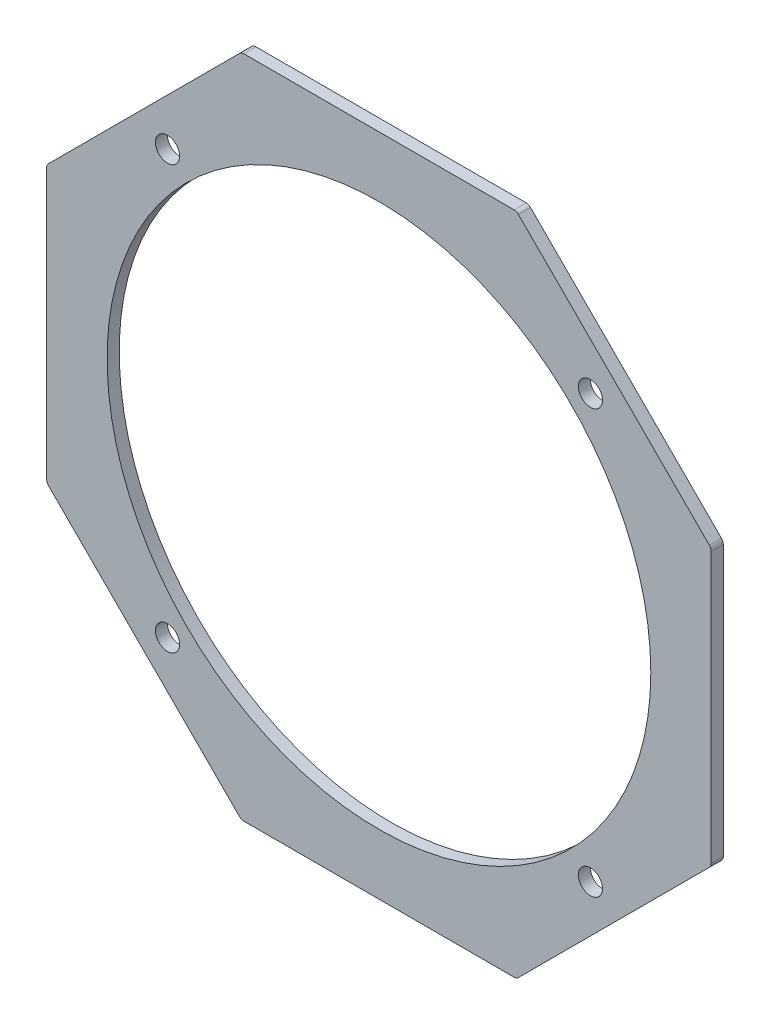
ISO-10303-21;
HEADER;
FILE_DESCRIPTION(('STEP AP214'),'2;1');
FILE_NAME('part.step','',(''),(''),'','','');
FILE_SCHEMA(('AUTOMOTIVE_DESIGN { 1 0 10303 214 1 1 1 1 }'));
ENDSEC;
DATA;
#1=APPLICATION_CONTEXT('core data for automotive mechanical design processes');
#2=APPLICATION_PROTOCOL_DEFINITION('international standard','automotive_design',2000,#1);
#3=PRODUCT_CONTEXT('',#1,'mechanical');
#4=PRODUCT('Part','Part','',(#3));
#5=PRODUCT_RELATED_PRODUCT_CATEGORY('part','',(#4));
#6=PRODUCT_DEFINITION_FORMATION('','',#4);
#7=PRODUCT_DEFINITION_CONTEXT('part definition',#1,'design');
#8=PRODUCT_DEFINITION('design','',#6,#7);
#9=PRODUCT_DEFINITION_SHAPE('','',#8);
#10=(LENGTH_UNIT() NAMED_UNIT(*) SI_UNIT(.MILLI.,.METRE.));
#11=(NAMED_UNIT(*) PLANE_ANGLE_UNIT() SI_UNIT($,.RADIAN.));
#12=(NAMED_UNIT(*) SI_UNIT($,.STERADIAN.) SOLID_ANGLE_UNIT());
#13=UNCERTAINTY_MEASURE_WITH_UNIT(LENGTH_MEASURE(1.E-05),#10,'distance_accuracy_value','');
#14=(GEOMETRIC_REPRESENTATION_CONTEXT(3) GLOBAL_UNCERTAINTY_ASSIGNED_CONTEXT((#13)) GLOBAL_UNIT_ASSIGNED_CONTEXT((#10,
#11,#12)) REPRESENTATION_CONTEXT('',''));
#15=CARTESIAN_POINT('',(0.,0.,0.));
#16=DIRECTION('',(0.,0.,1.));
#17=DIRECTION('',(1.,0.,0.));
#18=AXIS2_PLACEMENT_3D('',#15,#16,#17);
#19=CARTESIAN_POINT('',(0.,2001.48951402047,2.));
#20=DIRECTION('',(0.,-1.,0.));
#21=DIRECTION('',(0.,0.,-1.));
#22=AXIS2_PLACEMENT_3D('',#19,#20,#21);
#23=PLANE('',#22);
#24=DIRECTION('',(-1.,0.,0.));
#25=VECTOR('',#24,1.);
#26=CARTESIAN_POINT('',(0.,2001.48951402047,0.));
#27=LINE('',#26,#25);
#28=CARTESIAN_POINT('',(2676.01725865301,2001.48951402047,0.));
#29=VERTEX_POINT('',#28);
#30=CARTESIAN_POINT('',(2631.28219391672,2001.48951402047,0.));
#31=VERTEX_POINT('',#30);
#32=EDGE_CURVE('E199',#29,#31,#27,.T.);
#33=ORIENTED_EDGE('',*,*,#32,.T.);
#34=DIRECTION('',(0.,0.,-1.));
#35=VECTOR('',#34,1.);
#36=CARTESIAN_POINT('',(2631.28219391672,2001.48951402047,2.));
#37=LINE('',#36,#35);
#38=CARTESIAN_POINT('',(2631.28219391672,2001.48951402047,2.));
#39=VERTEX_POINT('',#38);
#40=EDGE_CURVE('E11',#39,#31,#37,.T.);
#41=ORIENTED_EDGE('',*,*,#40,.F.);
#42=DIRECTION('',(-1.,0.,0.));
#43=VECTOR('',#42,1.);
#44=CARTESIAN_POINT('',(0.,2001.48951402047,2.));
#45=LINE('',#44,#43);
#46=CARTESIAN_POINT('',(2676.01725865301,2001.48951402047,2.));
#47=VERTEX_POINT('',#46);
#48=EDGE_CURVE('E316',#47,#39,#45,.T.);
#49=ORIENTED_EDGE('',*,*,#48,.F.);
#50=DIRECTION('',(0.,0.,-1.));
#51=VECTOR('',#50,1.);
#52=CARTESIAN_POINT('',(2676.01725865301,2001.48951402047,2.));
#53=LINE('',#52,#51);
#54=EDGE_CURVE('E180',#47,#29,#53,.T.);
#55=ORIENTED_EDGE('',*,*,#54,.T.);
#56=EDGE_LOOP('',(#33,#41,#49,#55));
#57=FACE_BOUND('',#56,.T.);
#58=ADVANCED_FACE('F39',(#57),#23,.F.);
#59=CARTESIAN_POINT('',(2631.28219391672,2000.48951402047,2.));
#60=DIRECTION('',(0.,0.,-1.));
#61=DIRECTION('',(-1.,0.,0.));
#62=AXIS2_PLACEMENT_3D('',#59,#60,#61);
#63=CYLINDRICAL_SURFACE('',#62,1.00000000000034);
#64=CARTESIAN_POINT('',(2631.28219391672,2000.48951402047,0.));
#65=DIRECTION('',(0.,0.,1.));
#66=DIRECTION('',(1.,0.,0.));
#67=AXIS2_PLACEMENT_3D('',#64,#65,#66);
#68=CIRCLE('',#67,1.00000000000034);
#69=CARTESIAN_POINT('',(2630.57508713553,2001.19662080166,0.));
#70=VERTEX_POINT('',#69);
#71=EDGE_CURVE('E202',#31,#70,#68,.T.);
#72=ORIENTED_EDGE('',*,*,#71,.T.);
#73=DIRECTION('',(0.,0.,-1.));
#74=VECTOR('',#73,1.);
#75=CARTESIAN_POINT('',(2630.57508713553,2001.19662080166,2.));
#76=LINE('',#75,#74);
#77=CARTESIAN_POINT('',(2630.57508713553,2001.19662080166,2.));
#78=VERTEX_POINT('',#77);
#79=EDGE_CURVE('E48',#78,#70,#76,.T.);
#80=ORIENTED_EDGE('',*,*,#79,.F.);
#81=CARTESIAN_POINT('',(2631.28219391672,2000.48951402047,2.));
#82=DIRECTION('',(0.,0.,1.));
#83=DIRECTION('',(1.,0.,0.));
#84=AXIS2_PLACEMENT_3D('',#81,#82,#83);
#85=CIRCLE('',#84,1.00000000000034);
#86=EDGE_CURVE('E123',#39,#78,#85,.T.);
#87=ORIENTED_EDGE('',*,*,#86,.F.);
#88=ORIENTED_EDGE('',*,*,#40,.T.);
#89=EDGE_LOOP('',(#72,#80,#87,#88));
#90=FACE_BOUND('',#89,.T.);
#91=ADVANCED_FACE('F331',(#90),#63,.T.);
#92=CARTESIAN_POINT('',(314.689233166936,-314.689233166936,2.));
#93=DIRECTION('',(0.707106781186547,-0.707106781186547,0.));
#94=DIRECTION('',(0.707106781186548,0.707106781186548,0.));
#95=AXIS2_PLACEMENT_3D('',#92,#93,#94);
#96=PLANE('',#95);
#97=DIRECTION('',(-0.707106781186548,-0.707106781186548,0.));
#98=VECTOR('',#97,1.);
#99=CARTESIAN_POINT('',(314.689233166936,-314.689233166936,0.));
#100=LINE('',#99,#98);
#101=CARTESIAN_POINT('',(2598.94261950368,1969.56415316981,0.));
#102=VERTEX_POINT('',#101);
#103=EDGE_CURVE('E204',#70,#102,#100,.T.);
#104=ORIENTED_EDGE('',*,*,#103,.T.);
#105=DIRECTION('',(0.,0.,-1.));
#106=VECTOR('',#105,1.);
#107=CARTESIAN_POINT('',(2598.94261950368,1969.56415316981,2.));
#108=LINE('',#107,#106);
#109=CARTESIAN_POINT('',(2598.94261950368,1969.56415316981,2.));
#110=VERTEX_POINT('',#109);
#111=EDGE_CURVE('E260',#110,#102,#108,.T.);
#112=ORIENTED_EDGE('',*,*,#111,.F.);
#113=DIRECTION('',(-0.707106781186548,-0.707106781186548,0.));
#114=VECTOR('',#113,1.);
#115=CARTESIAN_POINT('',(314.689233166936,-314.689233166936,2.));
#116=LINE('',#115,#114);
#117=EDGE_CURVE('E268',#78,#110,#116,.T.);
#118=ORIENTED_EDGE('',*,*,#117,.F.);
#119=ORIENTED_EDGE('',*,*,#79,.T.);
#120=EDGE_LOOP('',(#104,#112,#118,#119));
#121=FACE_BOUND('',#120,.T.);
#122=ADVANCED_FACE('F266',(#121),#96,.F.);
#123=CARTESIAN_POINT('',(2599.64972628487,1968.85704638862,2.));
#124=DIRECTION('',(0.,0.,-1.));
#125=DIRECTION('',(-1.,0.,0.));
#126=AXIS2_PLACEMENT_3D('',#123,#124,#125);
#127=CYLINDRICAL_SURFACE('',#126,0.999999999999048);
#128=CARTESIAN_POINT('',(2599.64972628487,1968.85704638862,0.));
#129=DIRECTION('',(0.,0.,1.));
#130=DIRECTION('',(1.,0.,0.));
#131=AXIS2_PLACEMENT_3D('',#128,#129,#130);
#132=CIRCLE('',#131,0.999999999999048);
#133=CARTESIAN_POINT('',(2598.64972628487,1968.85704638862,0.));
#134=VERTEX_POINT('',#133);
#135=EDGE_CURVE('E206',#102,#134,#132,.T.);
#136=ORIENTED_EDGE('',*,*,#135,.T.);
#137=DIRECTION('',(0.,0.,-1.));
#138=VECTOR('',#137,1.);
#139=CARTESIAN_POINT('',(2598.64972628487,1968.85704638862,2.));
#140=LINE('',#139,#138);
#141=CARTESIAN_POINT('',(2598.64972628487,1968.85704638862,2.));
#142=VERTEX_POINT('',#141);
#143=EDGE_CURVE('E257',#142,#134,#140,.T.);
#144=ORIENTED_EDGE('',*,*,#143,.F.);
#145=CARTESIAN_POINT('',(2599.64972628487,1968.85704638862,2.));
#146=DIRECTION('',(0.,0.,1.));
#147=DIRECTION('',(1.,0.,0.));
#148=AXIS2_PLACEMENT_3D('',#145,#146,#147);
#149=CIRCLE('',#148,0.999999999999048);
#150=EDGE_CURVE('E286',#110,#142,#149,.T.);
#151=ORIENTED_EDGE('',*,*,#150,.F.);
#152=ORIENTED_EDGE('',*,*,#111,.T.);
#153=EDGE_LOOP('',(#136,#144,#151,#152));
#154=FACE_BOUND('',#153,.T.);
#155=ADVANCED_FACE('F277',(#154),#127,.T.);
#156=CARTESIAN_POINT('',(2598.64972628487,0.,2.));
#157=DIRECTION('',(1.,0.,0.));
#158=DIRECTION('',(0.,0.,-1.));
#159=AXIS2_PLACEMENT_3D('',#156,#157,#158);
#160=PLANE('',#159);
#161=DIRECTION('',(0.,-1.,0.));
#162=VECTOR('',#161,1.);
#163=CARTESIAN_POINT('',(2598.64972628487,0.,0.));
#164=LINE('',#163,#162);
#165=CARTESIAN_POINT('',(2598.64972628487,1924.12198165233,0.));
#166=VERTEX_POINT('',#165);
#167=EDGE_CURVE('E208',#134,#166,#164,.T.);
#168=ORIENTED_EDGE('',*,*,#167,.T.);
#169=DIRECTION('',(0.,0.,-1.));
#170=VECTOR('',#169,1.);
#171=CARTESIAN_POINT('',(2598.64972628487,1924.12198165233,2.));
#172=LINE('',#171,#170);
#173=CARTESIAN_POINT('',(2598.64972628487,1924.12198165233,2.));
#174=VERTEX_POINT('',#173);
#175=EDGE_CURVE('E254',#174,#166,#172,.T.);
#176=ORIENTED_EDGE('',*,*,#175,.F.);
#177=DIRECTION('',(0.,-1.,0.));
#178=VECTOR('',#177,1.);
#179=CARTESIAN_POINT('',(2598.64972628487,0.,2.));
#180=LINE('',#179,#178);
#181=EDGE_CURVE('E283',#142,#174,#180,.T.);
#182=ORIENTED_EDGE('',*,*,#181,.F.);
#183=ORIENTED_EDGE('',*,*,#143,.T.);
#184=EDGE_LOOP('',(#168,#176,#182,#183));
#185=FACE_BOUND('',#184,.T.);
#186=ADVANCED_FACE('F281',(#185),#160,.F.);
#187=CARTESIAN_POINT('',(2599.64972628487,1924.12198165233,2.));
#188=DIRECTION('',(0.,0.,-1.));
#189=DIRECTION('',(-1.,0.,0.));
#190=AXIS2_PLACEMENT_3D('',#187,#188,#189);
#191=CYLINDRICAL_SURFACE('',#190,1.00000000000042);
#192=CARTESIAN_POINT('',(2599.64972628487,1924.12198165233,0.));
#193=DIRECTION('',(0.,0.,1.));
#194=DIRECTION('',(1.,0.,0.));
#195=AXIS2_PLACEMENT_3D('',#192,#193,#194);
#196=CIRCLE('',#195,1.00000000000042);
#197=CARTESIAN_POINT('',(2598.94261950368,1923.41487487114,0.));
#198=VERTEX_POINT('',#197);
#199=EDGE_CURVE('E210',#166,#198,#196,.T.);
#200=ORIENTED_EDGE('',*,*,#199,.T.);
#201=DIRECTION('',(0.,0.,-1.));
#202=VECTOR('',#201,1.);
#203=CARTESIAN_POINT('',(2598.94261950368,1923.41487487114,2.));
#204=LINE('',#203,#202);
#205=CARTESIAN_POINT('',(2598.94261950368,1923.41487487114,2.));
#206=VERTEX_POINT('',#205);
#207=EDGE_CURVE('E251',#206,#198,#204,.T.);
#208=ORIENTED_EDGE('',*,*,#207,.F.);
#209=CARTESIAN_POINT('',(2599.64972628487,1924.12198165233,2.));
#210=DIRECTION('',(0.,0.,1.));
#211=DIRECTION('',(1.,0.,0.));
#212=AXIS2_PLACEMENT_3D('',#209,#210,#211);
#213=CIRCLE('',#212,1.00000000000042);
#214=EDGE_CURVE('E285',#174,#206,#213,.T.);
#215=ORIENTED_EDGE('',*,*,#214,.F.);
#216=ORIENTED_EDGE('',*,*,#175,.T.);
#217=EDGE_LOOP('',(#200,#208,#215,#216));
#218=FACE_BOUND('',#217,.T.);
#219=ADVANCED_FACE('F462',(#218),#191,.T.);
#220=CARTESIAN_POINT('',(2261.17874718741,2261.17874718741,2.));
#221=DIRECTION('',(0.707106781186547,0.707106781186547,0.));
#222=DIRECTION('',(-0.707106781186548,0.707106781186548,0.));
#223=AXIS2_PLACEMENT_3D('',#220,#221,#222);
#224=PLANE('',#223);
#225=DIRECTION('',(0.707106781186548,-0.707106781186548,0.));
#226=VECTOR('',#225,1.);
#227=CARTESIAN_POINT('',(2261.17874718741,2261.17874718741,0.));
#228=LINE('',#227,#226);
#229=CARTESIAN_POINT('',(2630.57508713553,1891.78240723929,0.));
#230=VERTEX_POINT('',#229);
#231=EDGE_CURVE('E212',#198,#230,#228,.T.);
#232=ORIENTED_EDGE('',*,*,#231,.T.);
#233=DIRECTION('',(0.,0.,-1.));
#234=VECTOR('',#233,1.);
#235=CARTESIAN_POINT('',(2630.57508713553,1891.78240723929,2.));
#236=LINE('',#235,#234);
#237=CARTESIAN_POINT('',(2630.57508713553,1891.78240723929,2.));
#238=VERTEX_POINT('',#237);
#239=EDGE_CURVE('E248',#238,#230,#236,.T.);
#240=ORIENTED_EDGE('',*,*,#239,.F.);
#241=DIRECTION('',(0.707106781186548,-0.707106781186548,0.));
#242=VECTOR('',#241,1.);
#243=CARTESIAN_POINT('',(2261.17874718741,2261.17874718741,2.));
#244=LINE('',#243,#242);
#245=EDGE_CURVE('E288',#206,#238,#244,.T.);
#246=ORIENTED_EDGE('',*,*,#245,.F.);
#247=ORIENTED_EDGE('',*,*,#207,.T.);
#248=EDGE_LOOP('',(#232,#240,#246,#247));
#249=FACE_BOUND('',#248,.T.);
#250=ADVANCED_FACE('F454',(#249),#224,.F.);
#251=CARTESIAN_POINT('',(2631.28219391672,1892.48951402047,2.));
#252=DIRECTION('',(0.,0.,-1.));
#253=DIRECTION('',(-1.,0.,0.));
#254=AXIS2_PLACEMENT_3D('',#251,#252,#253);
#255=CYLINDRICAL_SURFACE('',#254,1.00000000000015);
#256=CARTESIAN_POINT('',(2631.28219391672,1892.48951402047,0.));
#257=DIRECTION('',(0.,0.,1.));
#258=DIRECTION('',(1.,0.,0.));
#259=AXIS2_PLACEMENT_3D('',#256,#257,#258);
#260=CIRCLE('',#259,1.00000000000015);
#261=CARTESIAN_POINT('',(2631.28219391672,1891.48951402047,0.));
#262=VERTEX_POINT('',#261);
#263=EDGE_CURVE('E214',#230,#262,#260,.T.);
#264=ORIENTED_EDGE('',*,*,#263,.T.);
#265=DIRECTION('',(0.,0.,-1.));
#266=VECTOR('',#265,1.);
#267=CARTESIAN_POINT('',(2631.28219391672,1891.48951402047,2.));
#268=LINE('',#267,#266);
#269=CARTESIAN_POINT('',(2631.28219391672,1891.48951402047,2.));
#270=VERTEX_POINT('',#269);
#271=EDGE_CURVE('E245',#270,#262,#268,.T.);
#272=ORIENTED_EDGE('',*,*,#271,.F.);
#273=CARTESIAN_POINT('',(2631.28219391672,1892.48951402047,2.));
#274=DIRECTION('',(0.,0.,1.));
#275=DIRECTION('',(1.,0.,0.));
#276=AXIS2_PLACEMENT_3D('',#273,#274,#275);
#277=CIRCLE('',#276,1.00000000000015);
#278=EDGE_CURVE('E294',#238,#270,#277,.T.);
#279=ORIENTED_EDGE('',*,*,#278,.F.);
#280=ORIENTED_EDGE('',*,*,#239,.T.);
#281=EDGE_LOOP('',(#264,#272,#279,#280));
#282=FACE_BOUND('',#281,.T.);
#283=ADVANCED_FACE('F446',(#282),#255,.T.);
#284=CARTESIAN_POINT('',(0.,1891.48951402047,2.));
#285=DIRECTION('',(0.,1.,0.));
#286=DIRECTION('',(0.,0.,1.));
#287=AXIS2_PLACEMENT_3D('',#284,#285,#286);
#288=PLANE('',#287);
#289=DIRECTION('',(1.,0.,0.));
#290=VECTOR('',#289,1.);
#291=CARTESIAN_POINT('',(0.,1891.48951402047,0.));
#292=LINE('',#291,#290);
#293=CARTESIAN_POINT('',(2676.01725865301,1891.48951402047,0.));
#294=VERTEX_POINT('',#293);
#295=EDGE_CURVE('E216',#262,#294,#292,.T.);
#296=ORIENTED_EDGE('',*,*,#295,.T.);
#297=DIRECTION('',(0.,0.,-1.));
#298=VECTOR('',#297,1.);
#299=CARTESIAN_POINT('',(2676.01725865301,1891.48951402047,2.));
#300=LINE('',#299,#298);
#301=CARTESIAN_POINT('',(2676.01725865301,1891.48951402047,2.));
#302=VERTEX_POINT('',#301);
#303=EDGE_CURVE('E242',#302,#294,#300,.T.);
#304=ORIENTED_EDGE('',*,*,#303,.F.);
#305=DIRECTION('',(1.,0.,0.));
#306=VECTOR('',#305,1.);
#307=CARTESIAN_POINT('',(0.,1891.48951402047,2.));
#308=LINE('',#307,#306);
#309=EDGE_CURVE('E296',#270,#302,#308,.T.);
#310=ORIENTED_EDGE('',*,*,#309,.F.);
#311=ORIENTED_EDGE('',*,*,#271,.T.);
#312=EDGE_LOOP('',(#296,#304,#310,#311));
#313=FACE_BOUND('',#312,.T.);
#314=ADVANCED_FACE('F438',(#313),#288,.F.);
#315=CARTESIAN_POINT('',(2676.01725865301,1892.48951402047,2.));
#316=DIRECTION('',(0.,0.,-1.));
#317=DIRECTION('',(-1.,0.,0.));
#318=AXIS2_PLACEMENT_3D('',#315,#316,#317);
#319=CYLINDRICAL_SURFACE('',#318,1.00000000000053);
#320=CARTESIAN_POINT('',(2676.01725865301,1892.48951402047,0.));
#321=DIRECTION('',(0.,0.,1.));
#322=DIRECTION('',(1.,0.,0.));
#323=AXIS2_PLACEMENT_3D('',#320,#321,#322);
#324=CIRCLE('',#323,1.00000000000053);
#325=CARTESIAN_POINT('',(2676.7243654342,1891.78240723929,0.));
#326=VERTEX_POINT('',#325);
#327=EDGE_CURVE('E218',#294,#326,#324,.T.);
#328=ORIENTED_EDGE('',*,*,#327,.T.);
#329=DIRECTION('',(0.,0.,-1.));
#330=VECTOR('',#329,1.);
#331=CARTESIAN_POINT('',(2676.7243654342,1891.78240723929,2.));
#332=LINE('',#331,#330);
#333=CARTESIAN_POINT('',(2676.7243654342,1891.78240723929,2.));
#334=VERTEX_POINT('',#333);
#335=EDGE_CURVE('E239',#334,#326,#332,.T.);
#336=ORIENTED_EDGE('',*,*,#335,.F.);
#337=CARTESIAN_POINT('',(2676.01725865301,1892.48951402047,2.));
#338=DIRECTION('',(0.,0.,1.));
#339=DIRECTION('',(1.,0.,0.));
#340=AXIS2_PLACEMENT_3D('',#337,#338,#339);
#341=CIRCLE('',#340,1.00000000000053);
#342=EDGE_CURVE('E298',#302,#334,#341,.T.);
#343=ORIENTED_EDGE('',*,*,#342,.F.);
#344=ORIENTED_EDGE('',*,*,#303,.T.);
#345=EDGE_LOOP('',(#328,#336,#343,#344));
#346=FACE_BOUND('',#345,.T.);
#347=ADVANCED_FACE('F430',(#346),#319,.T.);
#348=CARTESIAN_POINT('',(392.470979097476,-392.47097909747,2.));
#349=DIRECTION('',(-0.707106781186553,0.707106781186543,0.));
#350=DIRECTION('',(-0.707106781186543,-0.707106781186553,0.));
#351=AXIS2_PLACEMENT_3D('',#348,#349,#350);
#352=PLANE('',#351);
#353=DIRECTION('',(0.707106781186543,0.707106781186553,0.));
#354=VECTOR('',#353,1.);
#355=CARTESIAN_POINT('',(392.470979097476,-392.47097909747,0.));
#356=LINE('',#355,#354);
#357=CARTESIAN_POINT('',(2708.35683306605,1923.41487487114,0.));
#358=VERTEX_POINT('',#357);
#359=EDGE_CURVE('E220',#326,#358,#356,.T.);
#360=ORIENTED_EDGE('',*,*,#359,.T.);
#361=DIRECTION('',(0.,0.,-1.));
#362=VECTOR('',#361,1.);
#363=CARTESIAN_POINT('',(2708.35683306605,1923.41487487114,2.));
#364=LINE('',#363,#362);
#365=CARTESIAN_POINT('',(2708.35683306605,1923.41487487114,2.));
#366=VERTEX_POINT('',#365);
#367=EDGE_CURVE('E236',#366,#358,#364,.T.);
#368=ORIENTED_EDGE('',*,*,#367,.F.);
#369=DIRECTION('',(0.707106781186543,0.707106781186553,0.));
#370=VECTOR('',#369,1.);
#371=CARTESIAN_POINT('',(392.470979097476,-392.47097909747,2.));
#372=LINE('',#371,#370);
#373=EDGE_CURVE('E300',#334,#366,#372,.T.);
#374=ORIENTED_EDGE('',*,*,#373,.F.);
#375=ORIENTED_EDGE('',*,*,#335,.T.);
#376=EDGE_LOOP('',(#360,#368,#374,#375));
#377=FACE_BOUND('',#376,.T.);
#378=ADVANCED_FACE('F423',(#377),#352,.F.);
#379=CARTESIAN_POINT('',(2707.64972628487,1924.12198165233,2.));
#380=DIRECTION('',(0.,0.,-1.));
#381=DIRECTION('',(-1.,0.,0.));
#382=AXIS2_PLACEMENT_3D('',#379,#380,#381);
#383=CYLINDRICAL_SURFACE('',#382,1.0000000000008);
#384=CARTESIAN_POINT('',(2707.64972628487,1924.12198165233,0.));
#385=DIRECTION('',(0.,0.,1.));
#386=DIRECTION('',(1.,0.,0.));
#387=AXIS2_PLACEMENT_3D('',#384,#385,#386);
#388=CIRCLE('',#387,1.0000000000008);
#389=CARTESIAN_POINT('',(2708.64972628487,1924.12198165233,0.));
#390=VERTEX_POINT('',#389);
#391=EDGE_CURVE('E222',#358,#390,#388,.T.);
#392=ORIENTED_EDGE('',*,*,#391,.T.);
#393=DIRECTION('',(0.,0.,-1.));
#394=VECTOR('',#393,1.);
#395=CARTESIAN_POINT('',(2708.64972628487,1924.12198165233,2.));
#396=LINE('',#395,#394);
#397=CARTESIAN_POINT('',(2708.64972628487,1924.12198165233,2.));
#398=VERTEX_POINT('',#397);
#399=EDGE_CURVE('E233',#398,#390,#396,.T.);
#400=ORIENTED_EDGE('',*,*,#399,.F.);
#401=CARTESIAN_POINT('',(2707.64972628487,1924.12198165233,2.));
#402=DIRECTION('',(0.,0.,1.));
#403=DIRECTION('',(1.,0.,0.));
#404=AXIS2_PLACEMENT_3D('',#401,#402,#403);
#405=CIRCLE('',#404,1.0000000000008);
#406=EDGE_CURVE('E302',#366,#398,#405,.T.);
#407=ORIENTED_EDGE('',*,*,#406,.F.);
#408=ORIENTED_EDGE('',*,*,#367,.T.);
#409=EDGE_LOOP('',(#392,#400,#407,#408));
#410=FACE_BOUND('',#409,.T.);
#411=ADVANCED_FACE('F308',(#410),#383,.T.);
#412=CARTESIAN_POINT('',(2708.64972628487,0.,2.));
#413=DIRECTION('',(-1.,0.,0.));
#414=DIRECTION('',(0.,0.,1.));
#415=AXIS2_PLACEMENT_3D('',#412,#413,#414);
#416=PLANE('',#415);
#417=DIRECTION('',(0.,1.,0.));
#418=VECTOR('',#417,1.);
#419=CARTESIAN_POINT('',(2708.64972628487,0.,0.));
#420=LINE('',#419,#418);
#421=CARTESIAN_POINT('',(2708.64972628487,1968.85704638862,0.));
#422=VERTEX_POINT('',#421);
#423=EDGE_CURVE('E224',#390,#422,#420,.T.);
#424=ORIENTED_EDGE('',*,*,#423,.T.);
#425=DIRECTION('',(0.,0.,-1.));
#426=VECTOR('',#425,1.);
#427=CARTESIAN_POINT('',(2708.64972628487,1968.85704638862,2.));
#428=LINE('',#427,#426);
#429=CARTESIAN_POINT('',(2708.64972628487,1968.85704638862,2.));
#430=VERTEX_POINT('',#429);
#431=EDGE_CURVE('E175',#430,#422,#428,.T.);
#432=ORIENTED_EDGE('',*,*,#431,.F.);
#433=DIRECTION('',(0.,1.,0.));
#434=VECTOR('',#433,1.);
#435=CARTESIAN_POINT('',(2708.64972628487,0.,2.));
#436=LINE('',#435,#434);
#437=EDGE_CURVE('E166',#398,#430,#436,.T.);
#438=ORIENTED_EDGE('',*,*,#437,.F.);
#439=ORIENTED_EDGE('',*,*,#399,.T.);
#440=EDGE_LOOP('',(#424,#432,#438,#439));
#441=FACE_BOUND('',#440,.T.);
#442=ADVANCED_FACE('F312',(#441),#416,.F.);
#443=CARTESIAN_POINT('',(2707.64972628487,1968.85704638862,2.));
#444=DIRECTION('',(0.,0.,-1.));
#445=DIRECTION('',(-1.,0.,0.));
#446=AXIS2_PLACEMENT_3D('',#443,#444,#445);
#447=CYLINDRICAL_SURFACE('',#446,0.999999999999427);
#448=CARTESIAN_POINT('',(2707.64972628487,1968.85704638862,0.));
#449=DIRECTION('',(0.,0.,1.));
#450=DIRECTION('',(1.,0.,0.));
#451=AXIS2_PLACEMENT_3D('',#448,#449,#450);
#452=CIRCLE('',#451,0.999999999999427);
#453=CARTESIAN_POINT('',(2708.35683306605,1969.56415316981,0.));
#454=VERTEX_POINT('',#453);
#455=EDGE_CURVE('E174',#422,#454,#452,.T.);
#456=ORIENTED_EDGE('',*,*,#455,.T.);
#457=DIRECTION('',(0.,0.,-1.));
#458=VECTOR('',#457,1.);
#459=CARTESIAN_POINT('',(2708.35683306605,1969.56415316981,2.));
#460=LINE('',#459,#458);
#461=CARTESIAN_POINT('',(2708.35683306605,1969.56415316981,2.));
#462=VERTEX_POINT('',#461);
#463=EDGE_CURVE('E171',#462,#454,#460,.T.);
#464=ORIENTED_EDGE('',*,*,#463,.F.);
#465=CARTESIAN_POINT('',(2707.64972628487,1968.85704638862,2.));
#466=DIRECTION('',(0.,0.,1.));
#467=DIRECTION('',(1.,0.,0.));
#468=AXIS2_PLACEMENT_3D('',#465,#466,#467);
#469=CIRCLE('',#468,0.999999999999427);
#470=EDGE_CURVE('E160',#430,#462,#469,.T.);
#471=ORIENTED_EDGE('',*,*,#470,.F.);
#472=ORIENTED_EDGE('',*,*,#431,.T.);
#473=EDGE_LOOP('',(#456,#464,#471,#472));
#474=FACE_BOUND('',#473,.T.);
#475=ADVANCED_FACE('F172',(#474),#447,.T.);
#476=CARTESIAN_POINT('',(2338.96049311795,2338.96049311792,2.));
#477=DIRECTION('',(-0.707106781186553,-0.707106781186543,0.));
#478=DIRECTION('',(0.707106781186543,-0.707106781186553,0.));
#479=AXIS2_PLACEMENT_3D('',#476,#477,#478);
#480=PLANE('',#479);
#481=DIRECTION('',(-0.707106781186543,0.707106781186553,0.));
#482=VECTOR('',#481,1.);
#483=CARTESIAN_POINT('',(2338.96049311795,2338.96049311792,0.));
#484=LINE('',#483,#482);
#485=CARTESIAN_POINT('',(2676.7243654342,2001.19662080166,0.));
#486=VERTEX_POINT('',#485);
#487=EDGE_CURVE('E109',#454,#486,#484,.T.);
#488=ORIENTED_EDGE('',*,*,#487,.T.);
#489=DIRECTION('',(0.,0.,-1.));
#490=VECTOR('',#489,1.);
#491=CARTESIAN_POINT('',(2676.7243654342,2001.19662080166,2.));
#492=LINE('',#491,#490);
#493=CARTESIAN_POINT('',(2676.7243654342,2001.19662080166,2.));
#494=VERTEX_POINT('',#493);
#495=EDGE_CURVE('E176',#494,#486,#492,.T.);
#496=ORIENTED_EDGE('',*,*,#495,.F.);
#497=DIRECTION('',(-0.707106781186543,0.707106781186553,0.));
#498=VECTOR('',#497,1.);
#499=CARTESIAN_POINT('',(2338.96049311795,2338.96049311792,2.));
#500=LINE('',#499,#498);
#501=EDGE_CURVE('E164',#462,#494,#500,.T.);
#502=ORIENTED_EDGE('',*,*,#501,.F.);
#503=ORIENTED_EDGE('',*,*,#463,.T.);
#504=EDGE_LOOP('',(#488,#496,#502,#503));
#505=FACE_BOUND('',#504,.T.);
#506=ADVANCED_FACE('F178',(#505),#480,.F.);
#507=CARTESIAN_POINT('',(2653.64972628487,1946.48951402047,2.));
#508=DIRECTION('',(0.,0.,-1.));
#509=DIRECTION('',(-1.,0.,0.));
#510=AXIS2_PLACEMENT_3D('',#507,#508,#509);
#511=CYLINDRICAL_SURFACE('',#510,44.9999999999999);
#512=CARTESIAN_POINT('',(2653.64972628487,1946.48951402047,2.));
#513=DIRECTION('',(0.,0.,1.));
#514=DIRECTION('',(1.,0.,0.));
#515=AXIS2_PLACEMENT_3D('',#512,#513,#514);
#516=CIRCLE('',#515,44.9999999999999);
#517=CARTESIAN_POINT('',(2698.64972628487,1946.48951402047,2.));
#518=VERTEX_POINT('',#517);
#519=EDGE_CURVE('E520',#518,#518,#516,.T.);
#520=ORIENTED_EDGE('',*,*,#519,.T.);
#521=EDGE_LOOP('',(#520));
#522=FACE_BOUND('',#521,.T.);
#523=CARTESIAN_POINT('',(2653.64972628487,1946.48951402047,0.));
#524=DIRECTION('',(0.,0.,1.));
#525=DIRECTION('',(1.,0.,0.));
#526=AXIS2_PLACEMENT_3D('',#523,#524,#525);
#527=CIRCLE('',#526,44.9999999999999);
#528=CARTESIAN_POINT('',(2698.64972628487,1946.48951402047,0.));
#529=VERTEX_POINT('',#528);
#530=EDGE_CURVE('E196',#529,#529,#527,.T.);
#531=ORIENTED_EDGE('',*,*,#530,.F.);
#532=EDGE_LOOP('',(#531));
#533=FACE_BOUND('',#532,.T.);
#534=ADVANCED_FACE('F339',(#522,#533),#511,.F.);
#535=CARTESIAN_POINT('',(2688.6515119536,1911.48772835174,2.));
#536=DIRECTION('',(0.,0.,-1.));
#537=DIRECTION('',(-1.,0.,0.));
#538=AXIS2_PLACEMENT_3D('',#535,#536,#537);
#539=CYLINDRICAL_SURFACE('',#538,1.99999999999978);
#540=CARTESIAN_POINT('',(2688.6515119536,1911.48772835174,2.));
#541=DIRECTION('',(0.,0.,1.));
#542=DIRECTION('',(1.,0.,0.));
#543=AXIS2_PLACEMENT_3D('',#540,#541,#542);
#544=CIRCLE('',#543,1.99999999999978);
#545=CARTESIAN_POINT('',(2690.6515119536,1911.48772835174,2.));
#546=VERTEX_POINT('',#545);
#547=EDGE_CURVE('E513',#546,#546,#544,.T.);
#548=ORIENTED_EDGE('',*,*,#547,.T.);
#549=EDGE_LOOP('',(#548));
#550=FACE_BOUND('',#549,.T.);
#551=CARTESIAN_POINT('',(2688.6515119536,1911.48772835174,0.));
#552=DIRECTION('',(0.,0.,1.));
#553=DIRECTION('',(1.,0.,0.));
#554=AXIS2_PLACEMENT_3D('',#551,#552,#553);
#555=CIRCLE('',#554,1.99999999999978);
#556=CARTESIAN_POINT('',(2690.6515119536,1911.48772835174,0.));
#557=VERTEX_POINT('',#556);
#558=EDGE_CURVE('E193',#557,#557,#555,.T.);
#559=ORIENTED_EDGE('',*,*,#558,.F.);
#560=EDGE_LOOP('',(#559));
#561=FACE_BOUND('',#560,.T.);
#562=ADVANCED_FACE('F342',(#550,#561),#539,.F.);
#563=CARTESIAN_POINT('',(2618.64794061613,1981.4912996892,2.));
#564=DIRECTION('',(0.,0.,-1.));
#565=DIRECTION('',(-1.,0.,0.));
#566=AXIS2_PLACEMENT_3D('',#563,#564,#565);
#567=CYLINDRICAL_SURFACE('',#566,1.99999999999978);
#568=CARTESIAN_POINT('',(2618.64794061613,1981.4912996892,2.));
#569=DIRECTION('',(0.,0.,1.));
#570=DIRECTION('',(1.,0.,0.));
#571=AXIS2_PLACEMENT_3D('',#568,#569,#570);
#572=CIRCLE('',#571,1.99999999999978);
#573=CARTESIAN_POINT('',(2620.64794061613,1981.4912996892,2.));
#574=VERTEX_POINT('',#573);
#575=EDGE_CURVE('E510',#574,#574,#572,.T.);
#576=ORIENTED_EDGE('',*,*,#575,.T.);
#577=EDGE_LOOP('',(#576));
#578=FACE_BOUND('',#577,.T.);
#579=CARTESIAN_POINT('',(2618.64794061613,1981.4912996892,0.));
#580=DIRECTION('',(0.,0.,1.));
#581=DIRECTION('',(1.,0.,0.));
#582=AXIS2_PLACEMENT_3D('',#579,#580,#581);
#583=CIRCLE('',#582,1.99999999999978);
#584=CARTESIAN_POINT('',(2620.64794061613,1981.4912996892,0.));
#585=VERTEX_POINT('',#584);
#586=EDGE_CURVE('E190',#585,#585,#583,.T.);
#587=ORIENTED_EDGE('',*,*,#586,.F.);
#588=EDGE_LOOP('',(#587));
#589=FACE_BOUND('',#588,.T.);
#590=ADVANCED_FACE('F346',(#578,#589),#567,.F.);
#591=CARTESIAN_POINT('',(2688.6515119536,1981.4912996892,2.));
#592=DIRECTION('',(0.,0.,-1.));
#593=DIRECTION('',(-1.,0.,0.));
#594=AXIS2_PLACEMENT_3D('',#591,#592,#593);
#595=CYLINDRICAL_SURFACE('',#594,1.99999999999978);
#596=CARTESIAN_POINT('',(2688.6515119536,1981.4912996892,2.));
#597=DIRECTION('',(0.,0.,1.));
#598=DIRECTION('',(1.,0.,0.));
#599=AXIS2_PLACEMENT_3D('',#596,#597,#598);
#600=CIRCLE('',#599,1.99999999999978);
#601=CARTESIAN_POINT('',(2690.6515119536,1981.4912996892,2.));
#602=VERTEX_POINT('',#601);
#603=EDGE_CURVE('E357',#602,#602,#600,.T.);
#604=ORIENTED_EDGE('',*,*,#603,.T.);
#605=EDGE_LOOP('',(#604));
#606=FACE_BOUND('',#605,.T.);
#607=CARTESIAN_POINT('',(2688.6515119536,1981.4912996892,0.));
#608=DIRECTION('',(0.,0.,1.));
#609=DIRECTION('',(1.,0.,0.));
#610=AXIS2_PLACEMENT_3D('',#607,#608,#609);
#611=CIRCLE('',#610,1.99999999999978);
#612=CARTESIAN_POINT('',(2690.6515119536,1981.4912996892,0.));
#613=VERTEX_POINT('',#612);
#614=EDGE_CURVE('E187',#613,#613,#611,.T.);
#615=ORIENTED_EDGE('',*,*,#614,.F.);
#616=EDGE_LOOP('',(#615));
#617=FACE_BOUND('',#616,.T.);
#618=ADVANCED_FACE('F326',(#606,#617),#595,.F.);
#619=CARTESIAN_POINT('',(2618.64794061613,1911.48772835174,2.));
#620=DIRECTION('',(0.,0.,-1.));
#621=DIRECTION('',(-1.,0.,0.));
#622=AXIS2_PLACEMENT_3D('',#619,#620,#621);
#623=CYLINDRICAL_SURFACE('',#622,1.99999999999978);
#624=CARTESIAN_POINT('',(2618.64794061613,1911.48772835174,2.));
#625=DIRECTION('',(0.,0.,1.));
#626=DIRECTION('',(1.,0.,0.));
#627=AXIS2_PLACEMENT_3D('',#624,#625,#626);
#628=CIRCLE('',#627,1.99999999999978);
#629=CARTESIAN_POINT('',(2620.64794061613,1911.48772835174,2.));
#630=VERTEX_POINT('',#629);
#631=EDGE_CURVE('E229',#630,#630,#628,.T.);
#632=ORIENTED_EDGE('',*,*,#631,.T.);
#633=EDGE_LOOP('',(#632));
#634=FACE_BOUND('',#633,.T.);
#635=CARTESIAN_POINT('',(2618.64794061613,1911.48772835174,0.));
#636=DIRECTION('',(0.,0.,1.));
#637=DIRECTION('',(1.,0.,0.));
#638=AXIS2_PLACEMENT_3D('',#635,#636,#637);
#639=CIRCLE('',#638,1.99999999999978);
#640=CARTESIAN_POINT('',(2620.64794061613,1911.48772835174,0.));
#641=VERTEX_POINT('',#640);
#642=EDGE_CURVE('E184',#641,#641,#639,.T.);
#643=ORIENTED_EDGE('',*,*,#642,.F.);
#644=EDGE_LOOP('',(#643));
#645=FACE_BOUND('',#644,.T.);
#646=ADVANCED_FACE('F41',(#634,#645),#623,.F.);
#647=CARTESIAN_POINT('',(2676.01725865301,2000.48951402047,2.));
#648=DIRECTION('',(0.,0.,-1.));
#649=DIRECTION('',(-1.,0.,0.));
#650=AXIS2_PLACEMENT_3D('',#647,#648,#649);
#651=CYLINDRICAL_SURFACE('',#650,1.00000000000072);
#652=CARTESIAN_POINT('',(2676.01725865301,2000.48951402047,0.));
#653=DIRECTION('',(0.,0.,1.));
#654=DIRECTION('',(1.,0.,0.));
#655=AXIS2_PLACEMENT_3D('',#652,#653,#654);
#656=CIRCLE('',#655,1.00000000000072);
#657=EDGE_CURVE('E115',#486,#29,#656,.T.);
#658=ORIENTED_EDGE('',*,*,#657,.T.);
#659=ORIENTED_EDGE('',*,*,#54,.F.);
#660=CARTESIAN_POINT('',(2676.01725865301,2000.48951402047,2.));
#661=DIRECTION('',(0.,0.,1.));
#662=DIRECTION('',(1.,0.,0.));
#663=AXIS2_PLACEMENT_3D('',#660,#661,#662);
#664=CIRCLE('',#663,1.00000000000072);
#665=EDGE_CURVE('E56',#494,#47,#664,.T.);
#666=ORIENTED_EDGE('',*,*,#665,.F.);
#667=ORIENTED_EDGE('',*,*,#495,.T.);
#668=EDGE_LOOP('',(#658,#659,#666,#667));
#669=FACE_BOUND('',#668,.T.);
#670=ADVANCED_FACE('F317',(#669),#651,.T.);
#671=CARTESIAN_POINT('',(0.,0.,2.));
#672=DIRECTION('',(0.,0.,1.));
#673=DIRECTION('',(1.,0.,0.));
#674=AXIS2_PLACEMENT_3D('',#671,#672,#673);
#675=PLANE('',#674);
#676=ORIENTED_EDGE('',*,*,#631,.F.);
#677=EDGE_LOOP('',(#676));
#678=FACE_BOUND('',#677,.T.);
#679=ORIENTED_EDGE('',*,*,#603,.F.);
#680=EDGE_LOOP('',(#679));
#681=FACE_BOUND('',#680,.T.);
#682=ORIENTED_EDGE('',*,*,#575,.F.);
#683=EDGE_LOOP('',(#682));
#684=FACE_BOUND('',#683,.T.);
#685=ORIENTED_EDGE('',*,*,#547,.F.);
#686=EDGE_LOOP('',(#685));
#687=FACE_BOUND('',#686,.T.);
#688=ORIENTED_EDGE('',*,*,#519,.F.);
#689=EDGE_LOOP('',(#688));
#690=FACE_BOUND('',#689,.T.);
#691=ORIENTED_EDGE('',*,*,#48,.T.);
#692=ORIENTED_EDGE('',*,*,#86,.T.);
#693=ORIENTED_EDGE('',*,*,#117,.T.);
#694=ORIENTED_EDGE('',*,*,#150,.T.);
#695=ORIENTED_EDGE('',*,*,#181,.T.);
#696=ORIENTED_EDGE('',*,*,#214,.T.);
#697=ORIENTED_EDGE('',*,*,#245,.T.);
#698=ORIENTED_EDGE('',*,*,#278,.T.);
#699=ORIENTED_EDGE('',*,*,#309,.T.);
#700=ORIENTED_EDGE('',*,*,#342,.T.);
#701=ORIENTED_EDGE('',*,*,#373,.T.);
#702=ORIENTED_EDGE('',*,*,#406,.T.);
#703=ORIENTED_EDGE('',*,*,#437,.T.);
#704=ORIENTED_EDGE('',*,*,#470,.T.);
#705=ORIENTED_EDGE('',*,*,#501,.T.);
#706=ORIENTED_EDGE('',*,*,#665,.T.);
#707=EDGE_LOOP('',(#691,#692,#693,#694,#695,#696,#697,#698,#699,#700,#701,#702,#703,#704,#705,#706));
#708=FACE_BOUND('',#707,.T.);
#709=ADVANCED_FACE('F162',(#678,#681,#684,#687,#690,#708),#675,.T.);
#710=CARTESIAN_POINT('',(0.,0.,0.));
#711=DIRECTION('',(0.,0.,1.));
#712=DIRECTION('',(1.,0.,0.));
#713=AXIS2_PLACEMENT_3D('',#710,#711,#712);
#714=PLANE('',#713);
#715=ORIENTED_EDGE('',*,*,#642,.T.);
#716=EDGE_LOOP('',(#715));
#717=FACE_BOUND('',#716,.T.);
#718=ORIENTED_EDGE('',*,*,#614,.T.);
#719=EDGE_LOOP('',(#718));
#720=FACE_BOUND('',#719,.T.);
#721=ORIENTED_EDGE('',*,*,#586,.T.);
#722=EDGE_LOOP('',(#721));
#723=FACE_BOUND('',#722,.T.);
#724=ORIENTED_EDGE('',*,*,#558,.T.);
#725=EDGE_LOOP('',(#724));
#726=FACE_BOUND('',#725,.T.);
#727=ORIENTED_EDGE('',*,*,#530,.T.);
#728=EDGE_LOOP('',(#727));
#729=FACE_BOUND('',#728,.T.);
#730=ORIENTED_EDGE('',*,*,#32,.F.);
#731=ORIENTED_EDGE('',*,*,#657,.F.);
#732=ORIENTED_EDGE('',*,*,#487,.F.);
#733=ORIENTED_EDGE('',*,*,#455,.F.);
#734=ORIENTED_EDGE('',*,*,#423,.F.);
#735=ORIENTED_EDGE('',*,*,#391,.F.);
#736=ORIENTED_EDGE('',*,*,#359,.F.);
#737=ORIENTED_EDGE('',*,*,#327,.F.);
#738=ORIENTED_EDGE('',*,*,#295,.F.);
#739=ORIENTED_EDGE('',*,*,#263,.F.);
#740=ORIENTED_EDGE('',*,*,#231,.F.);
#741=ORIENTED_EDGE('',*,*,#199,.F.);
#742=ORIENTED_EDGE('',*,*,#167,.F.);
#743=ORIENTED_EDGE('',*,*,#135,.F.);
#744=ORIENTED_EDGE('',*,*,#103,.F.);
#745=ORIENTED_EDGE('',*,*,#71,.F.);
#746=EDGE_LOOP('',(#730,#731,#732,#733,#734,#735,#736,#737,#738,#739,#740,#741,#742,#743,#744,#745));
#747=FACE_BOUND('',#746,.T.);
#748=ADVANCED_FACE('F272',(#717,#720,#723,#726,#729,#747),#714,.F.);
#749=CLOSED_SHELL('',(#58,#91,#122,#155,#186,#219,#250,#283,#314,#347,#378,#411,#442,#475,#506,
#534,#562,#590,#618,#646,#670,#709,#748));
#750=MANIFOLD_SOLID_BREP('B2',#749);
#751=ADVANCED_BREP_SHAPE_REPRESENTATION('',(#18,#750),#14);
#752=SHAPE_DEFINITION_REPRESENTATION(#9,#751);
ENDSEC;
END-ISO-10303-21;
